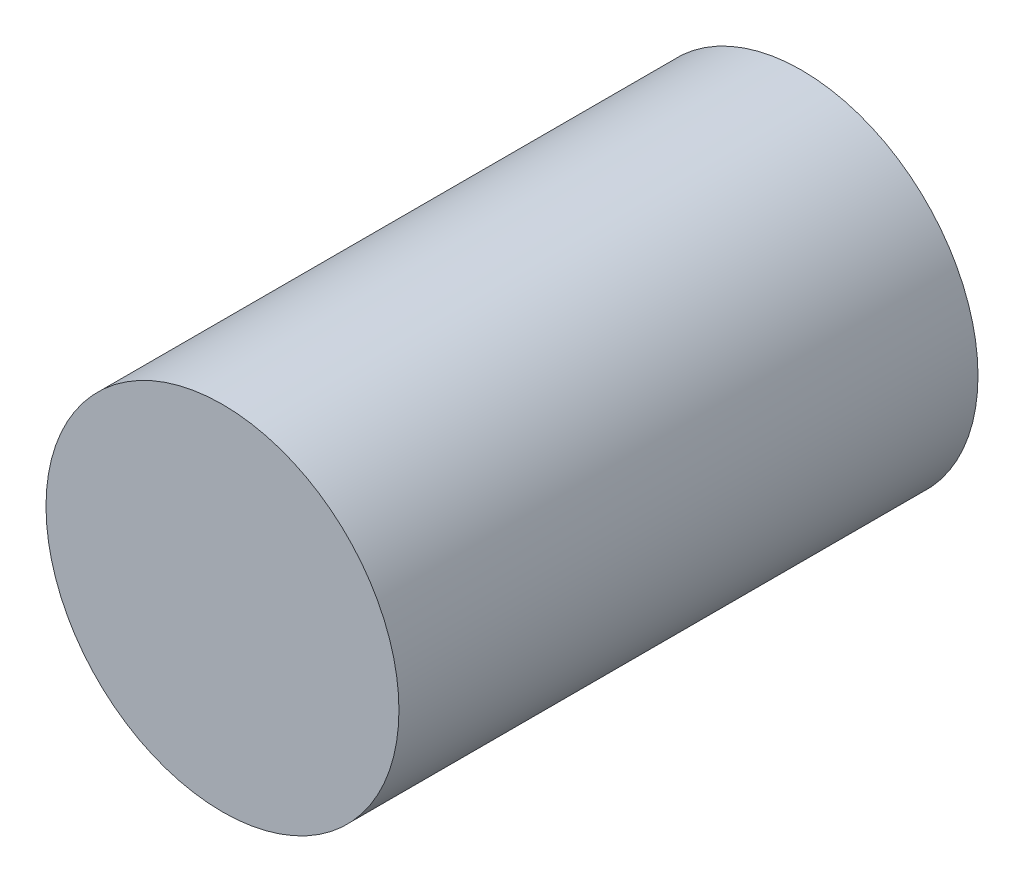
ISO-10303-21;
HEADER;
FILE_DESCRIPTION(('STEP AP214'),'2;1');
FILE_NAME('part.step','',(''),(''),'','','');
FILE_SCHEMA(('AUTOMOTIVE_DESIGN { 1 0 10303 214 1 1 1 1 }'));
ENDSEC;
DATA;
#1=APPLICATION_CONTEXT('core data for automotive mechanical design processes');
#2=APPLICATION_PROTOCOL_DEFINITION('international standard','automotive_design',2000,#1);
#3=PRODUCT_CONTEXT('',#1,'mechanical');
#4=PRODUCT('Part','Part','',(#3));
#5=PRODUCT_RELATED_PRODUCT_CATEGORY('part','',(#4));
#6=PRODUCT_DEFINITION_FORMATION('','',#4);
#7=PRODUCT_DEFINITION_CONTEXT('part definition',#1,'design');
#8=PRODUCT_DEFINITION('design','',#6,#7);
#9=PRODUCT_DEFINITION_SHAPE('','',#8);
#10=(LENGTH_UNIT() NAMED_UNIT(*) SI_UNIT(.MILLI.,.METRE.));
#11=(NAMED_UNIT(*) PLANE_ANGLE_UNIT() SI_UNIT($,.RADIAN.));
#12=(NAMED_UNIT(*) SI_UNIT($,.STERADIAN.) SOLID_ANGLE_UNIT());
#13=UNCERTAINTY_MEASURE_WITH_UNIT(LENGTH_MEASURE(1.E-05),#10,'distance_accuracy_value','');
#14=(GEOMETRIC_REPRESENTATION_CONTEXT(3) GLOBAL_UNCERTAINTY_ASSIGNED_CONTEXT((#13)) GLOBAL_UNIT_ASSIGNED_CONTEXT((#10,
#11,#12)) REPRESENTATION_CONTEXT('',''));
#15=CARTESIAN_POINT('',(0.,0.,0.));
#16=DIRECTION('',(0.,0.,1.));
#17=DIRECTION('',(1.,0.,0.));
#18=AXIS2_PLACEMENT_3D('',#15,#16,#17);
#19=CARTESIAN_POINT('',(0.,0.,21.));
#20=DIRECTION('',(0.,0.,-1.));
#21=DIRECTION('',(-1.,0.,0.));
#22=AXIS2_PLACEMENT_3D('',#19,#20,#21);
#23=CYLINDRICAL_SURFACE('',#22,6.4);
#24=CARTESIAN_POINT('',(0.,0.,21.));
#25=DIRECTION('',(0.,0.,1.));
#26=DIRECTION('',(1.,0.,0.));
#27=AXIS2_PLACEMENT_3D('',#24,#25,#26);
#28=CIRCLE('',#27,6.4);
#29=CARTESIAN_POINT('',(-6.4,0.,21.));
#30=VERTEX_POINT('',#29);
#31=EDGE_CURVE('E10',#30,#30,#28,.T.);
#32=CARTESIAN_POINT('',(0.,0.,0.));
#33=DIRECTION('',(0.,0.,1.));
#34=DIRECTION('',(1.,0.,0.));
#35=AXIS2_PLACEMENT_3D('',#32,#33,#34);
#36=CIRCLE('',#35,6.4);
#37=CARTESIAN_POINT('',(-6.4,0.,0.));
#38=VERTEX_POINT('',#37);
#39=EDGE_CURVE('E34',#38,#38,#36,.T.);
#40=CARTESIAN_POINT('',(-6.4,0.,21.));
#41=CARTESIAN_POINT('',(-6.4,0.,20.78125));
#42=CARTESIAN_POINT('',(-6.4,0.,20.5625));
#43=CARTESIAN_POINT('',(-6.4,0.,20.125));
#44=CARTESIAN_POINT('',(-6.4,0.,19.90625));
#45=CARTESIAN_POINT('',(-6.4,0.,19.46875));
#46=CARTESIAN_POINT('',(-6.4,0.,19.25));
#47=CARTESIAN_POINT('',(-6.4,0.,18.8125));
#48=CARTESIAN_POINT('',(-6.4,0.,18.59375));
#49=CARTESIAN_POINT('',(-6.4,0.,18.15625));
#50=CARTESIAN_POINT('',(-6.4,0.,17.9375));
#51=CARTESIAN_POINT('',(-6.4,0.,17.5));
#52=CARTESIAN_POINT('',(-6.4,0.,17.28125));
#53=CARTESIAN_POINT('',(-6.4,0.,16.84375));
#54=CARTESIAN_POINT('',(-6.4,0.,16.625));
#55=CARTESIAN_POINT('',(-6.4,0.,16.1875));
#56=CARTESIAN_POINT('',(-6.4,0.,15.96875));
#57=CARTESIAN_POINT('',(-6.4,0.,15.53125));
#58=CARTESIAN_POINT('',(-6.4,0.,15.3125));
#59=CARTESIAN_POINT('',(-6.4,0.,14.875));
#60=CARTESIAN_POINT('',(-6.4,0.,14.65625));
#61=CARTESIAN_POINT('',(-6.4,0.,14.21875));
#62=CARTESIAN_POINT('',(-6.4,0.,14.));
#63=CARTESIAN_POINT('',(-6.4,0.,13.5625));
#64=CARTESIAN_POINT('',(-6.4,0.,13.34375));
#65=CARTESIAN_POINT('',(-6.4,0.,12.90625));
#66=CARTESIAN_POINT('',(-6.4,0.,12.6875));
#67=CARTESIAN_POINT('',(-6.4,0.,12.25));
#68=CARTESIAN_POINT('',(-6.4,0.,12.03125));
#69=CARTESIAN_POINT('',(-6.4,0.,11.59375));
#70=CARTESIAN_POINT('',(-6.4,0.,11.375));
#71=CARTESIAN_POINT('',(-6.4,0.,10.9375));
#72=CARTESIAN_POINT('',(-6.4,0.,10.71875));
#73=CARTESIAN_POINT('',(-6.4,0.,10.28125));
#74=CARTESIAN_POINT('',(-6.4,0.,10.0625));
#75=CARTESIAN_POINT('',(-6.4,0.,9.625));
#76=CARTESIAN_POINT('',(-6.4,0.,9.40625));
#77=CARTESIAN_POINT('',(-6.4,0.,8.96875));
#78=CARTESIAN_POINT('',(-6.4,0.,8.75));
#79=CARTESIAN_POINT('',(-6.4,0.,8.3125));
#80=CARTESIAN_POINT('',(-6.4,0.,8.09375));
#81=CARTESIAN_POINT('',(-6.4,0.,7.65625));
#82=CARTESIAN_POINT('',(-6.4,0.,7.4375));
#83=CARTESIAN_POINT('',(-6.4,0.,7.));
#84=CARTESIAN_POINT('',(-6.4,0.,6.78125));
#85=CARTESIAN_POINT('',(-6.4,0.,6.34375));
#86=CARTESIAN_POINT('',(-6.4,0.,6.125));
#87=CARTESIAN_POINT('',(-6.4,0.,5.6875));
#88=CARTESIAN_POINT('',(-6.4,0.,5.46875));
#89=CARTESIAN_POINT('',(-6.4,0.,5.03125));
#90=CARTESIAN_POINT('',(-6.4,0.,4.8125));
#91=CARTESIAN_POINT('',(-6.4,0.,4.375));
#92=CARTESIAN_POINT('',(-6.4,0.,4.15625));
#93=CARTESIAN_POINT('',(-6.4,0.,3.71875));
#94=CARTESIAN_POINT('',(-6.4,0.,3.5));
#95=CARTESIAN_POINT('',(-6.4,0.,3.0625));
#96=CARTESIAN_POINT('',(-6.4,0.,2.84375));
#97=CARTESIAN_POINT('',(-6.4,0.,2.40625));
#98=CARTESIAN_POINT('',(-6.4,0.,2.1875));
#99=CARTESIAN_POINT('',(-6.4,0.,1.75));
#100=CARTESIAN_POINT('',(-6.4,0.,1.53125));
#101=CARTESIAN_POINT('',(-6.4,0.,1.09375));
#102=CARTESIAN_POINT('',(-6.4,0.,0.875000000000001));
#103=CARTESIAN_POINT('',(-6.4,0.,0.4375));
#104=CARTESIAN_POINT('',(-6.4,0.,0.21875));
#105=CARTESIAN_POINT('',(-6.4,0.,0.));
#106=B_SPLINE_CURVE_WITH_KNOTS('',3,(#40,#41,#42,#43,#44,#45,#46,#47,#48,#49,#50,#51,#52,#53,
#54,#55,#56,#57,#58,#59,#60,#61,#62,#63,#64,#65,#66,#67,#68,#69,#70,#71,#72,#73,#74,#75,#76,#77,
#78,#79,#80,#81,#82,#83,#84,#85,#86,#87,#88,#89,#90,#91,#92,#93,#94,#95,#96,#97,#98,#99,#100,
#101,#102,#103,#104,#105),.UNSPECIFIED.,.F.,.F.,(4,2,2,2,2,2,2,2,2,2,2,2,2,2,2,2,2,2,2,2,2,2,2,
2,2,2,2,2,2,2,2,2,4),(0.,0.656250000000001,1.3125,1.96875,2.625,3.28125,3.9375,4.59375,5.25,
5.90625,6.5625,7.21875,7.875,8.53125,9.1875,9.84375,10.5,11.15625,11.8125,12.46875,13.125,
13.78125,14.4375,15.09375,15.75,16.40625,17.0625,17.71875,18.375,19.03125,19.6875,20.34375,21.),.UNSPECIFIED.);
#107=EDGE_CURVE('BSEAM31',#30,#38,#106,.T.);
#108=ORIENTED_EDGE('',*,*,#31,.F.);
#109=ORIENTED_EDGE('',*,*,#39,.T.);
#110=ORIENTED_EDGE('',*,*,#107,.T.);
#111=ORIENTED_EDGE('',*,*,#107,.F.);
#112=EDGE_LOOP('',(#108,#110,#109,#111));
#113=FACE_BOUND('',#112,.T.);
#114=ADVANCED_FACE('F31',(#113),#23,.T.);
#115=CARTESIAN_POINT('',(0.,0.,21.));
#116=DIRECTION('',(0.,0.,1.));
#117=DIRECTION('',(1.,0.,0.));
#118=AXIS2_PLACEMENT_3D('',#115,#116,#117);
#119=PLANE('',#118);
#120=ORIENTED_EDGE('',*,*,#31,.T.);
#121=EDGE_LOOP('',(#120));
#122=FACE_BOUND('',#121,.T.);
#123=ADVANCED_FACE('F46',(#122),#119,.T.);
#124=CARTESIAN_POINT('',(0.,0.,0.));
#125=DIRECTION('',(0.,0.,1.));
#126=DIRECTION('',(1.,0.,0.));
#127=AXIS2_PLACEMENT_3D('',#124,#125,#126);
#128=PLANE('',#127);
#129=ORIENTED_EDGE('',*,*,#39,.F.);
#130=EDGE_LOOP('',(#129));
#131=FACE_BOUND('',#130,.T.);
#132=ADVANCED_FACE('F44',(#131),#128,.F.);
#133=CLOSED_SHELL('',(#114,#123,#132));
#134=MANIFOLD_SOLID_BREP('B2',#133);
#135=ADVANCED_BREP_SHAPE_REPRESENTATION('',(#18,#134),#14);
#136=SHAPE_DEFINITION_REPRESENTATION(#9,#135);
ENDSEC;
END-ISO-10303-21;
